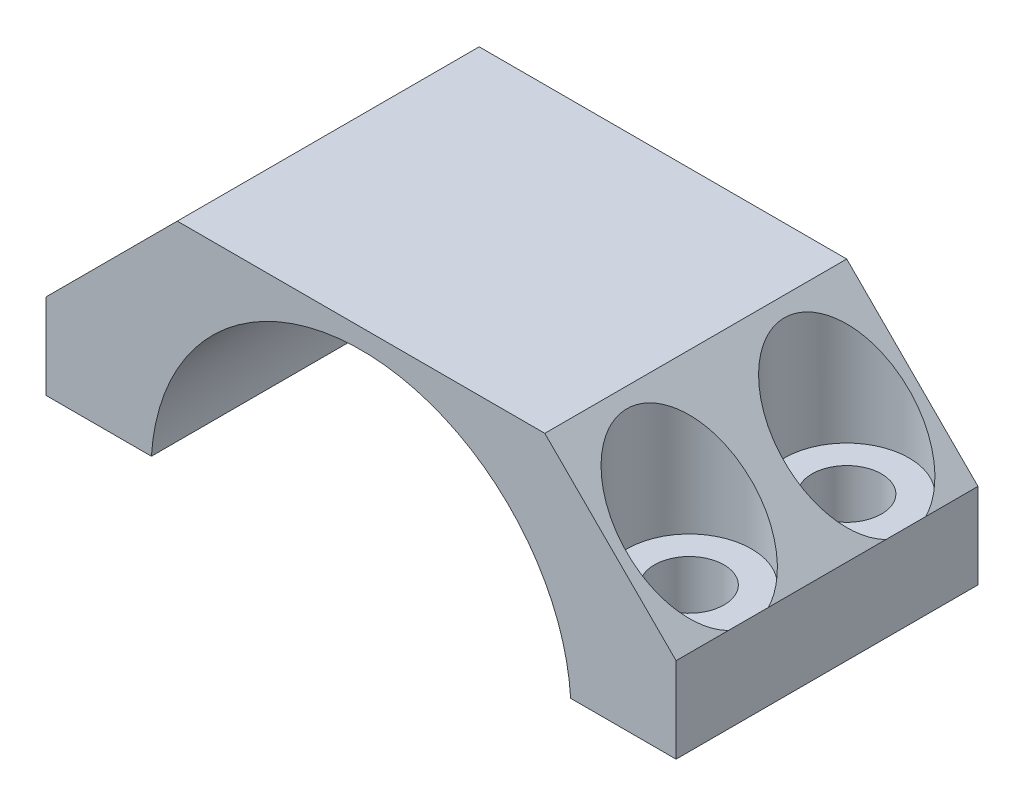
ISO-10303-21;
HEADER;
FILE_DESCRIPTION(('STEP AP214'),'2;1');
FILE_NAME('part.step','',(''),(''),'','','');
FILE_SCHEMA(('AUTOMOTIVE_DESIGN { 1 0 10303 214 1 1 1 1 }'));
ENDSEC;
DATA;
#1=APPLICATION_CONTEXT('core data for automotive mechanical design processes');
#2=APPLICATION_PROTOCOL_DEFINITION('international standard','automotive_design',2000,#1);
#3=PRODUCT_CONTEXT('',#1,'mechanical');
#4=PRODUCT('Part','Part','',(#3));
#5=PRODUCT_RELATED_PRODUCT_CATEGORY('part','',(#4));
#6=PRODUCT_DEFINITION_FORMATION('','',#4);
#7=PRODUCT_DEFINITION_CONTEXT('part definition',#1,'design');
#8=PRODUCT_DEFINITION('design','',#6,#7);
#9=PRODUCT_DEFINITION_SHAPE('','',#8);
#10=(LENGTH_UNIT() NAMED_UNIT(*) SI_UNIT(.MILLI.,.METRE.));
#11=(NAMED_UNIT(*) PLANE_ANGLE_UNIT() SI_UNIT($,.RADIAN.));
#12=(NAMED_UNIT(*) SI_UNIT($,.STERADIAN.) SOLID_ANGLE_UNIT());
#13=UNCERTAINTY_MEASURE_WITH_UNIT(LENGTH_MEASURE(1.E-05),#10,'distance_accuracy_value','');
#14=(GEOMETRIC_REPRESENTATION_CONTEXT(3) GLOBAL_UNCERTAINTY_ASSIGNED_CONTEXT((#13)) GLOBAL_UNIT_ASSIGNED_CONTEXT((#10,
#11,#12)) REPRESENTATION_CONTEXT('',''));
#15=CARTESIAN_POINT('',(0.,0.,0.));
#16=DIRECTION('',(0.,0.,1.));
#17=DIRECTION('',(1.,0.,0.));
#18=AXIS2_PLACEMENT_3D('',#15,#16,#17);
#19=CARTESIAN_POINT('',(0.,0.,11.5));
#20=DIRECTION('',(0.,0.,-1.));
#21=DIRECTION('',(-1.,0.,0.));
#22=AXIS2_PLACEMENT_3D('',#19,#20,#21);
#23=CYLINDRICAL_SURFACE('',#22,16.);
#24=CARTESIAN_POINT('',(0.,0.,11.5));
#25=DIRECTION('',(0.,0.,1.));
#26=DIRECTION('',(1.,0.,0.));
#27=AXIS2_PLACEMENT_3D('',#24,#25,#26);
#28=CIRCLE('',#27,16.);
#29=CARTESIAN_POINT('',(15.9687194226713,1.,11.5));
#30=VERTEX_POINT('',#29);
#31=CARTESIAN_POINT('',(-15.9687194226713,0.999999999999997,11.5));
#32=VERTEX_POINT('',#31);
#33=EDGE_CURVE('E163',#30,#32,#28,.T.);
#34=ORIENTED_EDGE('',*,*,#33,.T.);
#35=DIRECTION('',(0.,0.,-1.));
#36=VECTOR('',#35,1.);
#37=CARTESIAN_POINT('',(-15.9687194226713,0.999999999999997,11.5));
#38=LINE('',#37,#36);
#39=CARTESIAN_POINT('',(-15.9687194226713,0.999999999999997,-11.5));
#40=VERTEX_POINT('',#39);
#41=EDGE_CURVE('E240',#32,#40,#38,.T.);
#42=ORIENTED_EDGE('',*,*,#41,.T.);
#43=CARTESIAN_POINT('',(0.,0.,-11.5));
#44=DIRECTION('',(0.,0.,1.));
#45=DIRECTION('',(1.,0.,0.));
#46=AXIS2_PLACEMENT_3D('',#43,#44,#45);
#47=CIRCLE('',#46,16.);
#48=CARTESIAN_POINT('',(15.9687194226713,1.,-11.5));
#49=VERTEX_POINT('',#48);
#50=EDGE_CURVE('E153',#49,#40,#47,.T.);
#51=ORIENTED_EDGE('',*,*,#50,.F.);
#52=DIRECTION('',(0.,0.,-1.));
#53=VECTOR('',#52,1.);
#54=CARTESIAN_POINT('',(15.9687194226713,1.,11.5));
#55=LINE('',#54,#53);
#56=EDGE_CURVE('E54',#49,#30,#55,.F.);
#57=ORIENTED_EDGE('',*,*,#56,.T.);
#58=EDGE_LOOP('',(#34,#42,#51,#57));
#59=FACE_BOUND('',#58,.T.);
#60=ADVANCED_FACE('F39',(#59),#23,.F.);
#61=CARTESIAN_POINT('',(24.,0.,11.5));
#62=DIRECTION('',(1.,0.,0.));
#63=DIRECTION('',(0.,0.,-1.));
#64=AXIS2_PLACEMENT_3D('',#61,#62,#63);
#65=PLANE('',#64);
#66=DIRECTION('',(0.,-1.,0.));
#67=VECTOR('',#66,1.);
#68=CARTESIAN_POINT('',(24.,0.,11.5));
#69=LINE('',#68,#67);
#70=CARTESIAN_POINT('',(24.,7.5,11.5));
#71=VERTEX_POINT('',#70);
#72=CARTESIAN_POINT('',(24.,1.,11.5));
#73=VERTEX_POINT('',#72);
#74=EDGE_CURVE('E145',#71,#73,#69,.T.);
#75=ORIENTED_EDGE('',*,*,#74,.T.);
#76=DIRECTION('',(0.,0.,1.));
#77=VECTOR('',#76,1.);
#78=CARTESIAN_POINT('',(24.,1.,11.5));
#79=LINE('',#78,#77);
#80=CARTESIAN_POINT('',(24.,1.,-11.5));
#81=VERTEX_POINT('',#80);
#82=EDGE_CURVE('E129',#81,#73,#79,.T.);
#83=ORIENTED_EDGE('',*,*,#82,.F.);
#84=DIRECTION('',(0.,-1.,0.));
#85=VECTOR('',#84,1.);
#86=CARTESIAN_POINT('',(24.,0.,-11.5));
#87=LINE('',#86,#85);
#88=CARTESIAN_POINT('',(24.,7.5,-11.5));
#89=VERTEX_POINT('',#88);
#90=EDGE_CURVE('E142',#89,#81,#87,.T.);
#91=ORIENTED_EDGE('',*,*,#90,.F.);
#92=DIRECTION('',(0.,0.,1.));
#93=VECTOR('',#92,1.);
#94=CARTESIAN_POINT('',(24.,7.5,-11.501));
#95=LINE('',#94,#93);
#96=CARTESIAN_POINT('',(24.,7.5,-7.52069063257453));
#97=VERTEX_POINT('',#96);
#98=EDGE_CURVE('E264',#89,#97,#95,.T.);
#99=ORIENTED_EDGE('',*,*,#98,.T.);
#100=DIRECTION('',(0.,0.,-1.));
#101=VECTOR('',#100,1.);
#102=CARTESIAN_POINT('',(24.,7.50000000000001,11.5));
#103=LINE('',#102,#101);
#104=CARTESIAN_POINT('',(24.,7.5,-4.47930936742547));
#105=VERTEX_POINT('',#104);
#106=EDGE_CURVE('E164',#105,#97,#103,.T.);
#107=ORIENTED_EDGE('',*,*,#106,.F.);
#108=CARTESIAN_POINT('',(24.,7.5,4.47930936742547));
#109=VERTEX_POINT('',#108);
#110=EDGE_CURVE('E263',#105,#109,#95,.T.);
#111=ORIENTED_EDGE('',*,*,#110,.T.);
#112=DIRECTION('',(0.,0.,-1.));
#113=VECTOR('',#112,1.);
#114=CARTESIAN_POINT('',(24.,7.50000000000001,11.5));
#115=LINE('',#114,#113);
#116=CARTESIAN_POINT('',(24.,7.50000000000001,7.52069063257454));
#117=VERTEX_POINT('',#116);
#118=EDGE_CURVE('E167',#117,#109,#115,.T.);
#119=ORIENTED_EDGE('',*,*,#118,.F.);
#120=EDGE_CURVE('E261',#117,#71,#95,.T.);
#121=ORIENTED_EDGE('',*,*,#120,.T.);
#122=EDGE_LOOP('',(#75,#83,#91,#99,#107,#111,#119,#121));
#123=FACE_BOUND('',#122,.T.);
#124=ADVANCED_FACE('F140',(#123),#65,.T.);
#125=CARTESIAN_POINT('',(-24.,0.,11.5));
#126=DIRECTION('',(1.,0.,0.));
#127=DIRECTION('',(0.,1.,0.));
#128=AXIS2_PLACEMENT_3D('',#125,#126,#127);
#129=PLANE('',#128);
#130=DIRECTION('',(0.,0.,-1.));
#131=VECTOR('',#130,1.);
#132=CARTESIAN_POINT('',(-24.,0.999999999999996,11.5));
#133=LINE('',#132,#131);
#134=CARTESIAN_POINT('',(-24.,0.999999999999996,11.5));
#135=VERTEX_POINT('',#134);
#136=CARTESIAN_POINT('',(-24.,1.,-11.5));
#137=VERTEX_POINT('',#136);
#138=EDGE_CURVE('E62',#135,#137,#133,.T.);
#139=ORIENTED_EDGE('',*,*,#138,.F.);
#140=DIRECTION('',(0.,-1.,0.));
#141=VECTOR('',#140,1.);
#142=CARTESIAN_POINT('',(-24.,0.,11.5));
#143=LINE('',#142,#141);
#144=CARTESIAN_POINT('',(-24.,7.5,11.5));
#145=VERTEX_POINT('',#144);
#146=EDGE_CURVE('E168',#145,#135,#143,.T.);
#147=ORIENTED_EDGE('',*,*,#146,.F.);
#148=DIRECTION('',(0.,0.,1.));
#149=VECTOR('',#148,1.);
#150=CARTESIAN_POINT('',(-24.,7.5,-11.501));
#151=LINE('',#150,#149);
#152=CARTESIAN_POINT('',(-24.,7.5,7.52069063257453));
#153=VERTEX_POINT('',#152);
#154=EDGE_CURVE('E224',#153,#145,#151,.T.);
#155=ORIENTED_EDGE('',*,*,#154,.F.);
#156=DIRECTION('',(0.,0.,-1.));
#157=VECTOR('',#156,1.);
#158=CARTESIAN_POINT('',(-24.,7.50000000000001,11.5));
#159=LINE('',#158,#157);
#160=CARTESIAN_POINT('',(-24.,7.50000000000001,4.47930936742545));
#161=VERTEX_POINT('',#160);
#162=EDGE_CURVE('E11',#153,#161,#159,.T.);
#163=ORIENTED_EDGE('',*,*,#162,.T.);
#164=CARTESIAN_POINT('',(-24.,7.5,-4.47930936742546));
#165=VERTEX_POINT('',#164);
#166=EDGE_CURVE('E179',#165,#161,#151,.T.);
#167=ORIENTED_EDGE('',*,*,#166,.F.);
#168=DIRECTION('',(0.,0.,-1.));
#169=VECTOR('',#168,1.);
#170=CARTESIAN_POINT('',(-24.,7.50000000000001,11.5));
#171=LINE('',#170,#169);
#172=CARTESIAN_POINT('',(-24.,7.5,-7.52069063257454));
#173=VERTEX_POINT('',#172);
#174=EDGE_CURVE('E47',#165,#173,#171,.T.);
#175=ORIENTED_EDGE('',*,*,#174,.T.);
#176=CARTESIAN_POINT('',(-24.,7.5,-11.5));
#177=VERTEX_POINT('',#176);
#178=EDGE_CURVE('E177',#177,#173,#151,.T.);
#179=ORIENTED_EDGE('',*,*,#178,.F.);
#180=DIRECTION('',(0.,-1.,0.));
#181=VECTOR('',#180,1.);
#182=CARTESIAN_POINT('',(-24.,0.,-11.5));
#183=LINE('',#182,#181);
#184=EDGE_CURVE('E155',#177,#137,#183,.T.);
#185=ORIENTED_EDGE('',*,*,#184,.T.);
#186=EDGE_LOOP('',(#139,#147,#155,#163,#167,#175,#179,#185));
#187=FACE_BOUND('',#186,.T.);
#188=ADVANCED_FACE('F176',(#187),#129,.F.);
#189=CARTESIAN_POINT('',(0.,0.,11.5));
#190=DIRECTION('',(0.,0.,1.));
#191=DIRECTION('',(1.,0.,0.));
#192=AXIS2_PLACEMENT_3D('',#189,#190,#191);
#193=PLANE('',#192);
#194=ORIENTED_EDGE('',*,*,#146,.T.);
#195=DIRECTION('',(-1.,0.,0.));
#196=VECTOR('',#195,1.);
#197=CARTESIAN_POINT('',(-24.,0.999999999999996,11.5));
#198=LINE('',#197,#196);
#199=EDGE_CURVE('E146',#32,#135,#198,.T.);
#200=ORIENTED_EDGE('',*,*,#199,.F.);
#201=ORIENTED_EDGE('',*,*,#33,.F.);
#202=EDGE_CURVE('E228',#73,#30,#198,.T.);
#203=ORIENTED_EDGE('',*,*,#202,.F.);
#204=ORIENTED_EDGE('',*,*,#74,.F.);
#205=DIRECTION('',(0.707106781186548,-0.707106781186547,0.));
#206=VECTOR('',#205,1.);
#207=CARTESIAN_POINT('',(14.,17.5,11.5));
#208=LINE('',#207,#206);
#209=CARTESIAN_POINT('',(14.,17.5,11.5));
#210=VERTEX_POINT('',#209);
#211=EDGE_CURVE('E258',#210,#71,#208,.T.);
#212=ORIENTED_EDGE('',*,*,#211,.F.);
#213=DIRECTION('',(1.,0.,0.));
#214=VECTOR('',#213,1.);
#215=CARTESIAN_POINT('',(0.,17.5,11.5));
#216=LINE('',#215,#214);
#217=CARTESIAN_POINT('',(-14.,17.5,11.5));
#218=VERTEX_POINT('',#217);
#219=EDGE_CURVE('E213',#218,#210,#216,.T.);
#220=ORIENTED_EDGE('',*,*,#219,.F.);
#221=DIRECTION('',(0.707106781186548,0.707106781186547,0.));
#222=VECTOR('',#221,1.);
#223=CARTESIAN_POINT('',(-24.,7.5,11.5));
#224=LINE('',#223,#222);
#225=EDGE_CURVE('E222',#145,#218,#224,.T.);
#226=ORIENTED_EDGE('',*,*,#225,.F.);
#227=EDGE_LOOP('',(#194,#200,#201,#203,#204,#212,#220,#226));
#228=FACE_BOUND('',#227,.T.);
#229=ADVANCED_FACE('F219',(#228),#193,.T.);
#230=CARTESIAN_POINT('',(0.,0.,-11.5));
#231=DIRECTION('',(0.,0.,1.));
#232=DIRECTION('',(1.,0.,0.));
#233=AXIS2_PLACEMENT_3D('',#230,#231,#232);
#234=PLANE('',#233);
#235=DIRECTION('',(1.,0.,0.));
#236=VECTOR('',#235,1.);
#237=CARTESIAN_POINT('',(-24.,0.999999999999996,-11.5));
#238=LINE('',#237,#236);
#239=EDGE_CURVE('E135',#137,#40,#238,.T.);
#240=ORIENTED_EDGE('',*,*,#239,.F.);
#241=ORIENTED_EDGE('',*,*,#184,.F.);
#242=DIRECTION('',(-0.707106781186548,-0.707106781186547,0.));
#243=VECTOR('',#242,1.);
#244=CARTESIAN_POINT('',(-24.,7.5,-11.5));
#245=LINE('',#244,#243);
#246=CARTESIAN_POINT('',(-14.,17.5,-11.5));
#247=VERTEX_POINT('',#246);
#248=EDGE_CURVE('E246',#247,#177,#245,.T.);
#249=ORIENTED_EDGE('',*,*,#248,.F.);
#250=DIRECTION('',(1.,0.,0.));
#251=VECTOR('',#250,1.);
#252=CARTESIAN_POINT('',(0.,17.5,-11.5));
#253=LINE('',#252,#251);
#254=CARTESIAN_POINT('',(14.,17.5,-11.5));
#255=VERTEX_POINT('',#254);
#256=EDGE_CURVE('E152',#247,#255,#253,.T.);
#257=ORIENTED_EDGE('',*,*,#256,.T.);
#258=DIRECTION('',(-0.707106781186548,0.707106781186547,0.));
#259=VECTOR('',#258,1.);
#260=CARTESIAN_POINT('',(14.,17.5,-11.5));
#261=LINE('',#260,#259);
#262=EDGE_CURVE('E151',#89,#255,#261,.T.);
#263=ORIENTED_EDGE('',*,*,#262,.F.);
#264=ORIENTED_EDGE('',*,*,#90,.T.);
#265=EDGE_CURVE('E125',#49,#81,#238,.T.);
#266=ORIENTED_EDGE('',*,*,#265,.F.);
#267=ORIENTED_EDGE('',*,*,#50,.T.);
#268=EDGE_LOOP('',(#240,#241,#249,#257,#263,#264,#266,#267));
#269=FACE_BOUND('',#268,.T.);
#270=ADVANCED_FACE('F149',(#269),#234,.F.);
#271=CARTESIAN_POINT('',(19.5,17.5,-6.));
#272=DIRECTION('',(0.,1.,0.));
#273=DIRECTION('',(0.,0.,1.));
#274=AXIS2_PLACEMENT_3D('',#271,#272,#273);
#275=CYLINDRICAL_SURFACE('',#274,2.65);
#276=CARTESIAN_POINT('',(19.5,7.50000000000001,-6.));
#277=DIRECTION('',(0.,1.,0.));
#278=DIRECTION('',(0.,0.,1.));
#279=AXIS2_PLACEMENT_3D('',#276,#277,#278);
#280=CIRCLE('',#279,2.65);
#281=CARTESIAN_POINT('',(19.5,7.50000000000001,-3.35));
#282=VERTEX_POINT('',#281);
#283=EDGE_CURVE('E157',#282,#282,#280,.T.);
#284=ORIENTED_EDGE('',*,*,#283,.T.);
#285=EDGE_LOOP('',(#284));
#286=FACE_BOUND('',#285,.T.);
#287=CARTESIAN_POINT('',(19.5,1.,-6.));
#288=DIRECTION('',(0.,-1.,0.));
#289=DIRECTION('',(1.,0.,0.));
#290=AXIS2_PLACEMENT_3D('',#287,#288,#289);
#291=CIRCLE('',#290,2.65);
#292=CARTESIAN_POINT('',(22.15,1.,-6.));
#293=VERTEX_POINT('',#292);
#294=EDGE_CURVE('E236',#293,#293,#291,.F.);
#295=ORIENTED_EDGE('',*,*,#294,.F.);
#296=EDGE_LOOP('',(#295));
#297=FACE_BOUND('',#296,.T.);
#298=ADVANCED_FACE('F314',(#286,#297),#275,.F.);
#299=CARTESIAN_POINT('',(19.5,17.5,6.));
#300=DIRECTION('',(0.,1.,0.));
#301=DIRECTION('',(0.,0.,1.));
#302=AXIS2_PLACEMENT_3D('',#299,#300,#301);
#303=CYLINDRICAL_SURFACE('',#302,2.65);
#304=CARTESIAN_POINT('',(19.5,7.50000000000001,6.));
#305=DIRECTION('',(0.,1.,0.));
#306=DIRECTION('',(0.,0.,1.));
#307=AXIS2_PLACEMENT_3D('',#304,#305,#306);
#308=CIRCLE('',#307,2.65);
#309=CARTESIAN_POINT('',(19.5,7.50000000000001,8.65));
#310=VERTEX_POINT('',#309);
#311=EDGE_CURVE('E202',#310,#310,#308,.T.);
#312=ORIENTED_EDGE('',*,*,#311,.T.);
#313=EDGE_LOOP('',(#312));
#314=FACE_BOUND('',#313,.T.);
#315=CARTESIAN_POINT('',(19.5,1.,6.));
#316=DIRECTION('',(0.,-1.,0.));
#317=DIRECTION('',(1.,0.,0.));
#318=AXIS2_PLACEMENT_3D('',#315,#316,#317);
#319=CIRCLE('',#318,2.65);
#320=CARTESIAN_POINT('',(22.15,1.,6.));
#321=VERTEX_POINT('',#320);
#322=EDGE_CURVE('E233',#321,#321,#319,.F.);
#323=ORIENTED_EDGE('',*,*,#322,.F.);
#324=EDGE_LOOP('',(#323));
#325=FACE_BOUND('',#324,.T.);
#326=ADVANCED_FACE('F319',(#314,#325),#303,.F.);
#327=CARTESIAN_POINT('',(-19.5,17.5,-6.));
#328=DIRECTION('',(0.,1.,0.));
#329=DIRECTION('',(0.,0.,1.));
#330=AXIS2_PLACEMENT_3D('',#327,#328,#329);
#331=CYLINDRICAL_SURFACE('',#330,2.65);
#332=CARTESIAN_POINT('',(-19.5,7.50000000000001,-6.));
#333=DIRECTION('',(0.,1.,0.));
#334=DIRECTION('',(0.,0.,1.));
#335=AXIS2_PLACEMENT_3D('',#332,#333,#334);
#336=CIRCLE('',#335,2.65);
#337=CARTESIAN_POINT('',(-19.5,7.50000000000001,-3.35));
#338=VERTEX_POINT('',#337);
#339=EDGE_CURVE('E189',#338,#338,#336,.T.);
#340=ORIENTED_EDGE('',*,*,#339,.T.);
#341=EDGE_LOOP('',(#340));
#342=FACE_BOUND('',#341,.T.);
#343=CARTESIAN_POINT('',(-19.5,0.999999999999997,-6.));
#344=DIRECTION('',(0.,-1.,0.));
#345=DIRECTION('',(1.,0.,0.));
#346=AXIS2_PLACEMENT_3D('',#343,#344,#345);
#347=CIRCLE('',#346,2.65);
#348=CARTESIAN_POINT('',(-16.85,0.999999999999998,-6.));
#349=VERTEX_POINT('',#348);
#350=EDGE_CURVE('E230',#349,#349,#347,.F.);
#351=ORIENTED_EDGE('',*,*,#350,.F.);
#352=EDGE_LOOP('',(#351));
#353=FACE_BOUND('',#352,.T.);
#354=ADVANCED_FACE('F330',(#342,#353),#331,.F.);
#355=CARTESIAN_POINT('',(-19.5,17.5,6.));
#356=DIRECTION('',(0.,1.,0.));
#357=DIRECTION('',(0.,0.,1.));
#358=AXIS2_PLACEMENT_3D('',#355,#356,#357);
#359=CYLINDRICAL_SURFACE('',#358,2.65);
#360=CARTESIAN_POINT('',(-19.5,7.50000000000001,6.));
#361=DIRECTION('',(0.,1.,0.));
#362=DIRECTION('',(0.,0.,1.));
#363=AXIS2_PLACEMENT_3D('',#360,#361,#362);
#364=CIRCLE('',#363,2.65);
#365=CARTESIAN_POINT('',(-19.5,7.50000000000001,8.65));
#366=VERTEX_POINT('',#365);
#367=EDGE_CURVE('E190',#366,#366,#364,.T.);
#368=ORIENTED_EDGE('',*,*,#367,.T.);
#369=EDGE_LOOP('',(#368));
#370=FACE_BOUND('',#369,.T.);
#371=CARTESIAN_POINT('',(-19.5,0.999999999999997,6.));
#372=DIRECTION('',(0.,-1.,0.));
#373=DIRECTION('',(1.,0.,0.));
#374=AXIS2_PLACEMENT_3D('',#371,#372,#373);
#375=CIRCLE('',#374,2.65);
#376=CARTESIAN_POINT('',(-16.85,0.999999999999998,6.));
#377=VERTEX_POINT('',#376);
#378=EDGE_CURVE('E42',#377,#377,#375,.F.);
#379=ORIENTED_EDGE('',*,*,#378,.F.);
#380=EDGE_LOOP('',(#379));
#381=FACE_BOUND('',#380,.T.);
#382=ADVANCED_FACE('F309',(#370,#381),#359,.F.);
#383=CARTESIAN_POINT('',(0.,17.5,11.5));
#384=DIRECTION('',(0.,1.,0.));
#385=DIRECTION('',(-1.,0.,0.));
#386=AXIS2_PLACEMENT_3D('',#383,#384,#385);
#387=PLANE('',#386);
#388=DIRECTION('',(0.,0.,1.));
#389=VECTOR('',#388,1.);
#390=CARTESIAN_POINT('',(-14.,17.5,-11.501));
#391=LINE('',#390,#389);
#392=EDGE_CURVE('E249',#247,#218,#391,.T.);
#393=ORIENTED_EDGE('',*,*,#392,.T.);
#394=ORIENTED_EDGE('',*,*,#219,.T.);
#395=DIRECTION('',(0.,0.,1.));
#396=VECTOR('',#395,1.);
#397=CARTESIAN_POINT('',(14.,17.5,-11.501));
#398=LINE('',#397,#396);
#399=EDGE_CURVE('E260',#255,#210,#398,.T.);
#400=ORIENTED_EDGE('',*,*,#399,.F.);
#401=ORIENTED_EDGE('',*,*,#256,.F.);
#402=EDGE_LOOP('',(#393,#394,#400,#401));
#403=FACE_BOUND('',#402,.T.);
#404=ADVANCED_FACE('F306',(#403),#387,.T.);
#405=CARTESIAN_POINT('',(22.15,7.50000000000001,-6.));
#406=DIRECTION('',(0.,-1.,0.));
#407=DIRECTION('',(0.,0.,-1.));
#408=AXIS2_PLACEMENT_3D('',#405,#406,#407);
#409=PLANE('',#408);
#410=ORIENTED_EDGE('',*,*,#106,.T.);
#411=CARTESIAN_POINT('',(19.5,7.50000000000001,-6.));
#412=DIRECTION('',(0.,1.,0.));
#413=DIRECTION('',(0.,0.,1.));
#414=AXIS2_PLACEMENT_3D('',#411,#412,#413);
#415=CIRCLE('',#414,4.75);
#416=EDGE_CURVE('E205',#97,#105,#415,.T.);
#417=ORIENTED_EDGE('',*,*,#416,.T.);
#418=EDGE_LOOP('',(#410,#417));
#419=FACE_BOUND('',#418,.T.);
#420=ORIENTED_EDGE('',*,*,#283,.F.);
#421=EDGE_LOOP('',(#420));
#422=FACE_BOUND('',#421,.T.);
#423=ADVANCED_FACE('F308',(#419,#422),#409,.F.);
#424=CARTESIAN_POINT('',(19.5,17.5,-6.));
#425=DIRECTION('',(0.,1.,0.));
#426=DIRECTION('',(0.,0.,1.));
#427=AXIS2_PLACEMENT_3D('',#424,#425,#426);
#428=CYLINDRICAL_SURFACE('',#427,4.75);
#429=ORIENTED_EDGE('',*,*,#416,.F.);
#430=CARTESIAN_POINT('',(19.5,12.,-6.));
#431=DIRECTION('',(-0.707106781186547,-0.707106781186548,0.));
#432=DIRECTION('',(-0.707106781186548,0.707106781186547,0.));
#433=AXIS2_PLACEMENT_3D('',#430,#431,#432);
#434=ELLIPSE('',#433,6.71751442127219,4.75);
#435=EDGE_CURVE('E255',#105,#97,#434,.T.);
#436=ORIENTED_EDGE('',*,*,#435,.F.);
#437=EDGE_LOOP('',(#429,#436));
#438=FACE_BOUND('',#437,.T.);
#439=ADVANCED_FACE('F323',(#438),#428,.F.);
#440=CARTESIAN_POINT('',(22.15,7.50000000000001,6.));
#441=DIRECTION('',(0.,-1.,0.));
#442=DIRECTION('',(0.,0.,-1.));
#443=AXIS2_PLACEMENT_3D('',#440,#441,#442);
#444=PLANE('',#443);
#445=ORIENTED_EDGE('',*,*,#118,.T.);
#446=CARTESIAN_POINT('',(19.5,7.50000000000001,6.));
#447=DIRECTION('',(0.,1.,0.));
#448=DIRECTION('',(0.,0.,1.));
#449=AXIS2_PLACEMENT_3D('',#446,#447,#448);
#450=CIRCLE('',#449,4.75);
#451=EDGE_CURVE('E193',#109,#117,#450,.T.);
#452=ORIENTED_EDGE('',*,*,#451,.T.);
#453=EDGE_LOOP('',(#445,#452));
#454=FACE_BOUND('',#453,.T.);
#455=ORIENTED_EDGE('',*,*,#311,.F.);
#456=EDGE_LOOP('',(#455));
#457=FACE_BOUND('',#456,.T.);
#458=ADVANCED_FACE('F276',(#454,#457),#444,.F.);
#459=CARTESIAN_POINT('',(19.5,17.5,6.));
#460=DIRECTION('',(0.,1.,0.));
#461=DIRECTION('',(0.,0.,1.));
#462=AXIS2_PLACEMENT_3D('',#459,#460,#461);
#463=CYLINDRICAL_SURFACE('',#462,4.75);
#464=ORIENTED_EDGE('',*,*,#451,.F.);
#465=CARTESIAN_POINT('',(19.5,12.,6.));
#466=DIRECTION('',(-0.707106781186547,-0.707106781186548,0.));
#467=DIRECTION('',(-0.707106781186548,0.707106781186547,0.));
#468=AXIS2_PLACEMENT_3D('',#465,#466,#467);
#469=ELLIPSE('',#468,6.71751442127219,4.75);
#470=EDGE_CURVE('E253',#117,#109,#469,.T.);
#471=ORIENTED_EDGE('',*,*,#470,.F.);
#472=EDGE_LOOP('',(#464,#471));
#473=FACE_BOUND('',#472,.T.);
#474=ADVANCED_FACE('F280',(#473),#463,.F.);
#475=CARTESIAN_POINT('',(-16.85,7.50000000000001,-6.));
#476=DIRECTION('',(0.,-1.,0.));
#477=DIRECTION('',(0.,0.,-1.));
#478=AXIS2_PLACEMENT_3D('',#475,#476,#477);
#479=PLANE('',#478);
#480=ORIENTED_EDGE('',*,*,#339,.F.);
#481=EDGE_LOOP('',(#480));
#482=FACE_BOUND('',#481,.T.);
#483=CARTESIAN_POINT('',(-19.5,7.50000000000001,-6.));
#484=DIRECTION('',(0.,1.,0.));
#485=DIRECTION('',(0.,0.,1.));
#486=AXIS2_PLACEMENT_3D('',#483,#484,#485);
#487=CIRCLE('',#486,4.75);
#488=EDGE_CURVE('E184',#165,#173,#487,.T.);
#489=ORIENTED_EDGE('',*,*,#488,.T.);
#490=ORIENTED_EDGE('',*,*,#174,.F.);
#491=EDGE_LOOP('',(#489,#490));
#492=FACE_BOUND('',#491,.T.);
#493=ADVANCED_FACE('F183',(#482,#492),#479,.F.);
#494=CARTESIAN_POINT('',(-19.5,17.5,-6.));
#495=DIRECTION('',(0.,1.,0.));
#496=DIRECTION('',(0.,0.,1.));
#497=AXIS2_PLACEMENT_3D('',#494,#495,#496);
#498=CYLINDRICAL_SURFACE('',#497,4.75);
#499=ORIENTED_EDGE('',*,*,#488,.F.);
#500=CARTESIAN_POINT('',(-19.5,12.,-6.));
#501=DIRECTION('',(0.707106781186547,-0.707106781186548,0.));
#502=DIRECTION('',(0.707106781186548,0.707106781186547,0.));
#503=AXIS2_PLACEMENT_3D('',#500,#501,#502);
#504=ELLIPSE('',#503,6.7175144212722,4.75);
#505=EDGE_CURVE('E188',#173,#165,#504,.T.);
#506=ORIENTED_EDGE('',*,*,#505,.F.);
#507=EDGE_LOOP('',(#499,#506));
#508=FACE_BOUND('',#507,.T.);
#509=ADVANCED_FACE('F187',(#508),#498,.F.);
#510=CARTESIAN_POINT('',(-19.5,17.5,6.));
#511=DIRECTION('',(0.,1.,0.));
#512=DIRECTION('',(0.,0.,1.));
#513=AXIS2_PLACEMENT_3D('',#510,#511,#512);
#514=CYLINDRICAL_SURFACE('',#513,4.75);
#515=CARTESIAN_POINT('',(-19.5,7.50000000000001,6.));
#516=DIRECTION('',(0.,1.,0.));
#517=DIRECTION('',(0.,0.,1.));
#518=AXIS2_PLACEMENT_3D('',#515,#516,#517);
#519=CIRCLE('',#518,4.75);
#520=EDGE_CURVE('E196',#153,#161,#519,.T.);
#521=ORIENTED_EDGE('',*,*,#520,.F.);
#522=CARTESIAN_POINT('',(-19.5,12.,6.));
#523=DIRECTION('',(0.707106781186547,-0.707106781186548,0.));
#524=DIRECTION('',(0.707106781186548,0.707106781186547,0.));
#525=AXIS2_PLACEMENT_3D('',#522,#523,#524);
#526=ELLIPSE('',#525,6.7175144212722,4.75);
#527=EDGE_CURVE('E243',#161,#153,#526,.T.);
#528=ORIENTED_EDGE('',*,*,#527,.F.);
#529=EDGE_LOOP('',(#521,#528));
#530=FACE_BOUND('',#529,.T.);
#531=ADVANCED_FACE('F344',(#530),#514,.F.);
#532=CARTESIAN_POINT('',(-16.85,7.50000000000001,6.));
#533=DIRECTION('',(0.,-1.,0.));
#534=DIRECTION('',(0.,0.,-1.));
#535=AXIS2_PLACEMENT_3D('',#532,#533,#534);
#536=PLANE('',#535);
#537=ORIENTED_EDGE('',*,*,#367,.F.);
#538=EDGE_LOOP('',(#537));
#539=FACE_BOUND('',#538,.T.);
#540=ORIENTED_EDGE('',*,*,#520,.T.);
#541=ORIENTED_EDGE('',*,*,#162,.F.);
#542=EDGE_LOOP('',(#540,#541));
#543=FACE_BOUND('',#542,.T.);
#544=ADVANCED_FACE('F348',(#539,#543),#536,.F.);
#545=CARTESIAN_POINT('',(14.,17.5,-11.501));
#546=DIRECTION('',(-0.707106781186547,-0.707106781186548,0.));
#547=DIRECTION('',(0.707106781186548,-0.707106781186547,0.));
#548=AXIS2_PLACEMENT_3D('',#545,#546,#547);
#549=PLANE('',#548);
#550=ORIENTED_EDGE('',*,*,#262,.T.);
#551=ORIENTED_EDGE('',*,*,#399,.T.);
#552=ORIENTED_EDGE('',*,*,#211,.T.);
#553=ORIENTED_EDGE('',*,*,#120,.F.);
#554=ORIENTED_EDGE('',*,*,#470,.T.);
#555=ORIENTED_EDGE('',*,*,#110,.F.);
#556=ORIENTED_EDGE('',*,*,#435,.T.);
#557=ORIENTED_EDGE('',*,*,#98,.F.);
#558=EDGE_LOOP('',(#550,#551,#552,#553,#554,#555,#556,#557));
#559=FACE_BOUND('',#558,.T.);
#560=ADVANCED_FACE('F281',(#559),#549,.F.);
#561=CARTESIAN_POINT('',(-24.,7.5,-11.501));
#562=DIRECTION('',(0.707106781186547,-0.707106781186548,0.));
#563=DIRECTION('',(0.707106781186548,0.707106781186547,0.));
#564=AXIS2_PLACEMENT_3D('',#561,#562,#563);
#565=PLANE('',#564);
#566=ORIENTED_EDGE('',*,*,#248,.T.);
#567=ORIENTED_EDGE('',*,*,#178,.T.);
#568=ORIENTED_EDGE('',*,*,#505,.T.);
#569=ORIENTED_EDGE('',*,*,#166,.T.);
#570=ORIENTED_EDGE('',*,*,#527,.T.);
#571=ORIENTED_EDGE('',*,*,#154,.T.);
#572=ORIENTED_EDGE('',*,*,#225,.T.);
#573=ORIENTED_EDGE('',*,*,#392,.F.);
#574=EDGE_LOOP('',(#566,#567,#568,#569,#570,#571,#572,#573));
#575=FACE_BOUND('',#574,.T.);
#576=ADVANCED_FACE('F287',(#575),#565,.F.);
#577=CARTESIAN_POINT('',(0.,1.,0.));
#578=DIRECTION('',(0.,-1.,0.));
#579=DIRECTION('',(1.,0.,0.));
#580=AXIS2_PLACEMENT_3D('',#577,#578,#579);
#581=PLANE('',#580);
#582=ORIENTED_EDGE('',*,*,#350,.T.);
#583=EDGE_LOOP('',(#582));
#584=FACE_BOUND('',#583,.T.);
#585=ORIENTED_EDGE('',*,*,#378,.T.);
#586=EDGE_LOOP('',(#585));
#587=FACE_BOUND('',#586,.T.);
#588=ORIENTED_EDGE('',*,*,#199,.T.);
#589=ORIENTED_EDGE('',*,*,#138,.T.);
#590=ORIENTED_EDGE('',*,*,#239,.T.);
#591=ORIENTED_EDGE('',*,*,#41,.F.);
#592=EDGE_LOOP('',(#588,#589,#590,#591));
#593=FACE_BOUND('',#592,.T.);
#594=ADVANCED_FACE('F285',(#584,#587,#593),#581,.T.);
#595=ORIENTED_EDGE('',*,*,#265,.T.);
#596=ORIENTED_EDGE('',*,*,#82,.T.);
#597=ORIENTED_EDGE('',*,*,#202,.T.);
#598=ORIENTED_EDGE('',*,*,#56,.F.);
#599=EDGE_LOOP('',(#595,#596,#597,#598));
#600=FACE_BOUND('',#599,.T.);
#601=ORIENTED_EDGE('',*,*,#322,.T.);
#602=EDGE_LOOP('',(#601));
#603=FACE_BOUND('',#602,.T.);
#604=ORIENTED_EDGE('',*,*,#294,.T.);
#605=EDGE_LOOP('',(#604));
#606=FACE_BOUND('',#605,.T.);
#607=ADVANCED_FACE('F127',(#600,#603,#606),#581,.T.);
#608=CLOSED_SHELL('',(#60,#124,#188,#229,#270,#298,#326,#354,#382,#404,#423,#439,#458,#474,#493,
#509,#531,#544,#560,#576,#594,#607));
#609=MANIFOLD_SOLID_BREP('B2',#608);
#610=ADVANCED_BREP_SHAPE_REPRESENTATION('',(#18,#609),#14);
#611=SHAPE_DEFINITION_REPRESENTATION(#9,#610);
ENDSEC;
END-ISO-10303-21;
